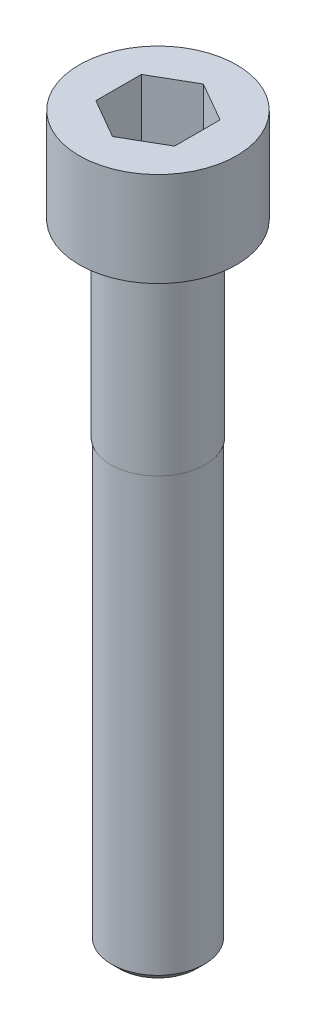
ISO-10303-21;
HEADER;
FILE_DESCRIPTION(('STEP AP214'),'2;1');
FILE_NAME('part.step','',(''),(''),'','','');
FILE_SCHEMA(('AUTOMOTIVE_DESIGN { 1 0 10303 214 1 1 1 1 }'));
ENDSEC;
DATA;
#1=APPLICATION_CONTEXT('core data for automotive mechanical design processes');
#2=APPLICATION_PROTOCOL_DEFINITION('international standard','automotive_design',2000,#1);
#3=PRODUCT_CONTEXT('',#1,'mechanical');
#4=PRODUCT('Part','Part','',(#3));
#5=PRODUCT_RELATED_PRODUCT_CATEGORY('part','',(#4));
#6=PRODUCT_DEFINITION_FORMATION('','',#4);
#7=PRODUCT_DEFINITION_CONTEXT('part definition',#1,'design');
#8=PRODUCT_DEFINITION('design','',#6,#7);
#9=PRODUCT_DEFINITION_SHAPE('','',#8);
#10=(LENGTH_UNIT() NAMED_UNIT(*) SI_UNIT(.MILLI.,.METRE.));
#11=(NAMED_UNIT(*) PLANE_ANGLE_UNIT() SI_UNIT($,.RADIAN.));
#12=(NAMED_UNIT(*) SI_UNIT($,.STERADIAN.) SOLID_ANGLE_UNIT());
#13=UNCERTAINTY_MEASURE_WITH_UNIT(LENGTH_MEASURE(1.E-05),#10,'distance_accuracy_value','');
#14=(GEOMETRIC_REPRESENTATION_CONTEXT(3) GLOBAL_UNCERTAINTY_ASSIGNED_CONTEXT((#13)) GLOBAL_UNIT_ASSIGNED_CONTEXT((#10,
#11,#12)) REPRESENTATION_CONTEXT('',''));
#15=CARTESIAN_POINT('',(0.,0.,0.));
#16=DIRECTION('',(0.,0.,1.));
#17=DIRECTION('',(1.,0.,0.));
#18=AXIS2_PLACEMENT_3D('',#15,#16,#17);
#19=CARTESIAN_POINT('',(0.,0.,0.));
#20=DIRECTION('',(0.,-1.,0.));
#21=DIRECTION('',(0.,0.,-1.));
#22=AXIS2_PLACEMENT_3D('',#19,#20,#21);
#23=PLANE('',#22);
#24=CARTESIAN_POINT('',(0.,0.,0.));
#25=DIRECTION('',(0.,1.,0.));
#26=DIRECTION('',(0.,0.,1.));
#27=AXIS2_PLACEMENT_3D('',#24,#25,#26);
#28=CIRCLE('',#27,2.44999999999999);
#29=CARTESIAN_POINT('',(0.,0.,2.44999999999999));
#30=VERTEX_POINT('',#29);
#31=EDGE_CURVE('E11',#30,#30,#28,.T.);
#32=ORIENTED_EDGE('',*,*,#31,.F.);
#33=EDGE_LOOP('',(#32));
#34=FACE_BOUND('',#33,.T.);
#35=ADVANCED_FACE('F33',(#34),#23,.T.);
#36=CARTESIAN_POINT('',(0.,0.5,0.));
#37=DIRECTION('',(0.,1.,0.));
#38=DIRECTION('',(0.,0.,1.));
#39=AXIS2_PLACEMENT_3D('',#36,#37,#38);
#40=CONICAL_SURFACE('',#39,2.94999999999999,0.785398163397448);
#41=ORIENTED_EDGE('',*,*,#31,.T.);
#42=EDGE_LOOP('',(#41));
#43=FACE_BOUND('',#42,.T.);
#44=CARTESIAN_POINT('',(0.,0.5,0.));
#45=DIRECTION('',(0.,1.,0.));
#46=DIRECTION('',(0.,0.,1.));
#47=AXIS2_PLACEMENT_3D('',#44,#45,#46);
#48=CIRCLE('',#47,2.94999999999999);
#49=CARTESIAN_POINT('',(0.,0.5,2.94999999999999));
#50=VERTEX_POINT('',#49);
#51=EDGE_CURVE('E40',#50,#50,#48,.T.);
#52=ORIENTED_EDGE('',*,*,#51,.F.);
#53=EDGE_LOOP('',(#52));
#54=FACE_BOUND('',#53,.T.);
#55=ADVANCED_FACE('F159',(#43,#54),#40,.T.);
#56=CARTESIAN_POINT('',(0.,46.,0.));
#57=DIRECTION('',(0.,1.,0.));
#58=DIRECTION('',(0.,0.,1.));
#59=AXIS2_PLACEMENT_3D('',#56,#57,#58);
#60=CYLINDRICAL_SURFACE('',#59,2.94999999999999);
#61=ORIENTED_EDGE('',*,*,#51,.T.);
#62=EDGE_LOOP('',(#61));
#63=FACE_BOUND('',#62,.T.);
#64=CARTESIAN_POINT('',(0.,28.,0.));
#65=DIRECTION('',(0.,1.,0.));
#66=DIRECTION('',(0.,0.,1.));
#67=AXIS2_PLACEMENT_3D('',#64,#65,#66);
#68=CIRCLE('',#67,2.94999999999999);
#69=CARTESIAN_POINT('',(0.,28.,2.94999999999999));
#70=VERTEX_POINT('',#69);
#71=EDGE_CURVE('E151',#70,#70,#68,.T.);
#72=ORIENTED_EDGE('',*,*,#71,.F.);
#73=EDGE_LOOP('',(#72));
#74=FACE_BOUND('',#73,.T.);
#75=ADVANCED_FACE('F156',(#63,#74),#60,.T.);
#76=CARTESIAN_POINT('',(-2.94999999999999,28.,0.));
#77=DIRECTION('',(0.,-1.,0.));
#78=DIRECTION('',(0.,0.,-1.));
#79=AXIS2_PLACEMENT_3D('',#76,#77,#78);
#80=PLANE('',#79);
#81=ORIENTED_EDGE('',*,*,#71,.T.);
#82=EDGE_LOOP('',(#81));
#83=FACE_BOUND('',#82,.T.);
#84=CARTESIAN_POINT('',(0.,28.,0.));
#85=DIRECTION('',(0.,1.,0.));
#86=DIRECTION('',(0.,0.,1.));
#87=AXIS2_PLACEMENT_3D('',#84,#85,#86);
#88=CIRCLE('',#87,3.);
#89=CARTESIAN_POINT('',(0.,28.,3.));
#90=VERTEX_POINT('',#89);
#91=EDGE_CURVE('E148',#90,#90,#88,.T.);
#92=ORIENTED_EDGE('',*,*,#91,.F.);
#93=EDGE_LOOP('',(#92));
#94=FACE_BOUND('',#93,.T.);
#95=ADVANCED_FACE('F166',(#83,#94),#80,.T.);
#96=CARTESIAN_POINT('',(0.,46.,0.));
#97=DIRECTION('',(0.,1.,0.));
#98=DIRECTION('',(0.,0.,1.));
#99=AXIS2_PLACEMENT_3D('',#96,#97,#98);
#100=CYLINDRICAL_SURFACE('',#99,3.);
#101=ORIENTED_EDGE('',*,*,#91,.T.);
#102=EDGE_LOOP('',(#101));
#103=FACE_BOUND('',#102,.T.);
#104=CARTESIAN_POINT('',(0.,40.,0.));
#105=DIRECTION('',(0.,1.,0.));
#106=DIRECTION('',(0.,0.,1.));
#107=AXIS2_PLACEMENT_3D('',#104,#105,#106);
#108=CIRCLE('',#107,3.);
#109=CARTESIAN_POINT('',(0.,40.,3.));
#110=VERTEX_POINT('',#109);
#111=EDGE_CURVE('E145',#110,#110,#108,.T.);
#112=ORIENTED_EDGE('',*,*,#111,.F.);
#113=EDGE_LOOP('',(#112));
#114=FACE_BOUND('',#113,.T.);
#115=ADVANCED_FACE('F172',(#103,#114),#100,.T.);
#116=CARTESIAN_POINT('',(-3.,40.,0.));
#117=DIRECTION('',(0.,-1.,0.));
#118=DIRECTION('',(0.,0.,-1.));
#119=AXIS2_PLACEMENT_3D('',#116,#117,#118);
#120=PLANE('',#119);
#121=ORIENTED_EDGE('',*,*,#111,.T.);
#122=EDGE_LOOP('',(#121));
#123=FACE_BOUND('',#122,.T.);
#124=CARTESIAN_POINT('',(0.,40.,0.));
#125=DIRECTION('',(0.,1.,0.));
#126=DIRECTION('',(0.,0.,1.));
#127=AXIS2_PLACEMENT_3D('',#124,#125,#126);
#128=CIRCLE('',#127,5.);
#129=CARTESIAN_POINT('',(0.,40.,5.));
#130=VERTEX_POINT('',#129);
#131=EDGE_CURVE('E142',#130,#130,#128,.T.);
#132=ORIENTED_EDGE('',*,*,#131,.F.);
#133=EDGE_LOOP('',(#132));
#134=FACE_BOUND('',#133,.T.);
#135=ADVANCED_FACE('F176',(#123,#134),#120,.T.);
#136=CARTESIAN_POINT('',(0.,46.,0.));
#137=DIRECTION('',(0.,1.,0.));
#138=DIRECTION('',(0.,0.,1.));
#139=AXIS2_PLACEMENT_3D('',#136,#137,#138);
#140=CYLINDRICAL_SURFACE('',#139,5.);
#141=ORIENTED_EDGE('',*,*,#131,.T.);
#142=EDGE_LOOP('',(#141));
#143=FACE_BOUND('',#142,.T.);
#144=CARTESIAN_POINT('',(0.,46.,0.));
#145=DIRECTION('',(0.,1.,0.));
#146=DIRECTION('',(0.,0.,1.));
#147=AXIS2_PLACEMENT_3D('',#144,#145,#146);
#148=CIRCLE('',#147,5.);
#149=CARTESIAN_POINT('',(0.,46.,5.));
#150=VERTEX_POINT('',#149);
#151=EDGE_CURVE('E134',#150,#150,#148,.T.);
#152=ORIENTED_EDGE('',*,*,#151,.F.);
#153=EDGE_LOOP('',(#152));
#154=FACE_BOUND('',#153,.T.);
#155=ADVANCED_FACE('F180',(#143,#154),#140,.T.);
#156=CARTESIAN_POINT('',(-5.,46.,0.));
#157=DIRECTION('',(0.,1.,0.));
#158=DIRECTION('',(0.,0.,1.));
#159=AXIS2_PLACEMENT_3D('',#156,#157,#158);
#160=PLANE('',#159);
#161=DIRECTION('',(0.866025403784439,0.,-0.5));
#162=VECTOR('',#161,1.);
#163=CARTESIAN_POINT('',(0.,46.,2.88675134594813));
#164=LINE('',#163,#162);
#165=CARTESIAN_POINT('',(0.,46.,2.88675134594813));
#166=VERTEX_POINT('',#165);
#167=CARTESIAN_POINT('',(2.5,46.,1.44337567297406));
#168=VERTEX_POINT('',#167);
#169=EDGE_CURVE('E47',#166,#168,#164,.T.);
#170=ORIENTED_EDGE('',*,*,#169,.F.);
#171=DIRECTION('',(0.866025403784439,0.,0.5));
#172=VECTOR('',#171,1.);
#173=CARTESIAN_POINT('',(-2.5,46.,1.44337567297406));
#174=LINE('',#173,#172);
#175=CARTESIAN_POINT('',(-2.5,46.,1.44337567297406));
#176=VERTEX_POINT('',#175);
#177=EDGE_CURVE('E130',#176,#166,#174,.T.);
#178=ORIENTED_EDGE('',*,*,#177,.F.);
#179=DIRECTION('',(0.,0.,1.));
#180=VECTOR('',#179,1.);
#181=CARTESIAN_POINT('',(-2.5,46.,-1.44337567297406));
#182=LINE('',#181,#180);
#183=CARTESIAN_POINT('',(-2.5,46.,-1.44337567297406));
#184=VERTEX_POINT('',#183);
#185=EDGE_CURVE('E128',#184,#176,#182,.T.);
#186=ORIENTED_EDGE('',*,*,#185,.F.);
#187=DIRECTION('',(-0.866025403784439,0.,0.5));
#188=VECTOR('',#187,1.);
#189=CARTESIAN_POINT('',(0.,46.,-2.88675134594813));
#190=LINE('',#189,#188);
#191=CARTESIAN_POINT('',(0.,46.,-2.88675134594813));
#192=VERTEX_POINT('',#191);
#193=EDGE_CURVE('E95',#192,#184,#190,.T.);
#194=ORIENTED_EDGE('',*,*,#193,.F.);
#195=DIRECTION('',(-0.866025403784439,0.,-0.5));
#196=VECTOR('',#195,1.);
#197=CARTESIAN_POINT('',(2.5,46.,-1.44337567297406));
#198=LINE('',#197,#196);
#199=CARTESIAN_POINT('',(2.5,46.,-1.44337567297406));
#200=VERTEX_POINT('',#199);
#201=EDGE_CURVE('E124',#200,#192,#198,.T.);
#202=ORIENTED_EDGE('',*,*,#201,.F.);
#203=DIRECTION('',(0.,0.,-1.));
#204=VECTOR('',#203,1.);
#205=CARTESIAN_POINT('',(2.5,46.,1.44337567297406));
#206=LINE('',#205,#204);
#207=EDGE_CURVE('E121',#168,#200,#206,.T.);
#208=ORIENTED_EDGE('',*,*,#207,.F.);
#209=EDGE_LOOP('',(#170,#178,#186,#194,#202,#208));
#210=FACE_BOUND('',#209,.T.);
#211=ORIENTED_EDGE('',*,*,#151,.T.);
#212=EDGE_LOOP('',(#211));
#213=FACE_BOUND('',#212,.T.);
#214=ADVANCED_FACE('F184',(#210,#213),#160,.T.);
#215=CARTESIAN_POINT('',(0.,42.,2.88675134594813));
#216=DIRECTION('',(0.5,0.,0.866025403784439));
#217=DIRECTION('',(0.866025403784439,0.,-0.5));
#218=AXIS2_PLACEMENT_3D('',#215,#216,#217);
#219=PLANE('',#218);
#220=ORIENTED_EDGE('',*,*,#169,.T.);
#221=DIRECTION('',(0.,1.,0.));
#222=VECTOR('',#221,1.);
#223=CARTESIAN_POINT('',(2.5,42.,1.44337567297406));
#224=LINE('',#223,#222);
#225=CARTESIAN_POINT('',(2.5,42.,1.44337567297406));
#226=VERTEX_POINT('',#225);
#227=EDGE_CURVE('E77',#226,#168,#224,.T.);
#228=ORIENTED_EDGE('',*,*,#227,.F.);
#229=DIRECTION('',(0.866025403784439,0.,-0.5));
#230=VECTOR('',#229,1.);
#231=CARTESIAN_POINT('',(0.,42.,2.88675134594813));
#232=LINE('',#231,#230);
#233=CARTESIAN_POINT('',(0.,42.,2.88675134594813));
#234=VERTEX_POINT('',#233);
#235=EDGE_CURVE('E132',#234,#226,#232,.T.);
#236=ORIENTED_EDGE('',*,*,#235,.F.);
#237=DIRECTION('',(0.,1.,0.));
#238=VECTOR('',#237,1.);
#239=CARTESIAN_POINT('',(0.,42.,2.88675134594813));
#240=LINE('',#239,#238);
#241=EDGE_CURVE('E55',#234,#166,#240,.T.);
#242=ORIENTED_EDGE('',*,*,#241,.T.);
#243=EDGE_LOOP('',(#220,#228,#236,#242));
#244=FACE_BOUND('',#243,.T.);
#245=ADVANCED_FACE('F188',(#244),#219,.F.);
#246=CARTESIAN_POINT('',(-2.5,42.,1.44337567297406));
#247=DIRECTION('',(-0.5,0.,0.866025403784439));
#248=DIRECTION('',(0.866025403784439,0.,0.5));
#249=AXIS2_PLACEMENT_3D('',#246,#247,#248);
#250=PLANE('',#249);
#251=ORIENTED_EDGE('',*,*,#177,.T.);
#252=ORIENTED_EDGE('',*,*,#241,.F.);
#253=DIRECTION('',(0.866025403784439,0.,0.5));
#254=VECTOR('',#253,1.);
#255=CARTESIAN_POINT('',(-2.5,42.,1.44337567297406));
#256=LINE('',#255,#254);
#257=CARTESIAN_POINT('',(-2.5,42.,1.44337567297406));
#258=VERTEX_POINT('',#257);
#259=EDGE_CURVE('E107',#258,#234,#256,.T.);
#260=ORIENTED_EDGE('',*,*,#259,.F.);
#261=DIRECTION('',(0.,1.,0.));
#262=VECTOR('',#261,1.);
#263=CARTESIAN_POINT('',(-2.5,42.,1.44337567297406));
#264=LINE('',#263,#262);
#265=EDGE_CURVE('E99',#258,#176,#264,.T.);
#266=ORIENTED_EDGE('',*,*,#265,.T.);
#267=EDGE_LOOP('',(#251,#252,#260,#266));
#268=FACE_BOUND('',#267,.T.);
#269=ADVANCED_FACE('F192',(#268),#250,.F.);
#270=CARTESIAN_POINT('',(-2.5,42.,-1.44337567297406));
#271=DIRECTION('',(-1.,0.,0.));
#272=DIRECTION('',(0.,0.,1.));
#273=AXIS2_PLACEMENT_3D('',#270,#271,#272);
#274=PLANE('',#273);
#275=ORIENTED_EDGE('',*,*,#185,.T.);
#276=ORIENTED_EDGE('',*,*,#265,.F.);
#277=DIRECTION('',(0.,0.,1.));
#278=VECTOR('',#277,1.);
#279=CARTESIAN_POINT('',(-2.5,42.,-1.44337567297406));
#280=LINE('',#279,#278);
#281=CARTESIAN_POINT('',(-2.5,42.,-1.44337567297406));
#282=VERTEX_POINT('',#281);
#283=EDGE_CURVE('E103',#282,#258,#280,.T.);
#284=ORIENTED_EDGE('',*,*,#283,.F.);
#285=DIRECTION('',(0.,1.,0.));
#286=VECTOR('',#285,1.);
#287=CARTESIAN_POINT('',(-2.5,42.,-1.44337567297406));
#288=LINE('',#287,#286);
#289=EDGE_CURVE('E88',#282,#184,#288,.T.);
#290=ORIENTED_EDGE('',*,*,#289,.T.);
#291=EDGE_LOOP('',(#275,#276,#284,#290));
#292=FACE_BOUND('',#291,.T.);
#293=ADVANCED_FACE('F104',(#292),#274,.F.);
#294=CARTESIAN_POINT('',(0.,42.,-2.88675134594813));
#295=DIRECTION('',(-0.5,0.,-0.866025403784439));
#296=DIRECTION('',(-0.866025403784439,0.,0.5));
#297=AXIS2_PLACEMENT_3D('',#294,#295,#296);
#298=PLANE('',#297);
#299=ORIENTED_EDGE('',*,*,#193,.T.);
#300=ORIENTED_EDGE('',*,*,#289,.F.);
#301=DIRECTION('',(-0.866025403784439,0.,0.5));
#302=VECTOR('',#301,1.);
#303=CARTESIAN_POINT('',(0.,42.,-2.88675134594813));
#304=LINE('',#303,#302);
#305=CARTESIAN_POINT('',(0.,42.,-2.88675134594813));
#306=VERTEX_POINT('',#305);
#307=EDGE_CURVE('E92',#306,#282,#304,.T.);
#308=ORIENTED_EDGE('',*,*,#307,.F.);
#309=DIRECTION('',(0.,1.,0.));
#310=VECTOR('',#309,1.);
#311=CARTESIAN_POINT('',(0.,42.,-2.88675134594813));
#312=LINE('',#311,#310);
#313=EDGE_CURVE('E100',#306,#192,#312,.T.);
#314=ORIENTED_EDGE('',*,*,#313,.T.);
#315=EDGE_LOOP('',(#299,#300,#308,#314));
#316=FACE_BOUND('',#315,.T.);
#317=ADVANCED_FACE('F90',(#316),#298,.F.);
#318=CARTESIAN_POINT('',(2.5,42.,-1.44337567297406));
#319=DIRECTION('',(0.5,0.,-0.866025403784439));
#320=DIRECTION('',(-0.866025403784439,0.,-0.5));
#321=AXIS2_PLACEMENT_3D('',#318,#319,#320);
#322=PLANE('',#321);
#323=ORIENTED_EDGE('',*,*,#201,.T.);
#324=ORIENTED_EDGE('',*,*,#313,.F.);
#325=DIRECTION('',(-0.866025403784439,0.,-0.5));
#326=VECTOR('',#325,1.);
#327=CARTESIAN_POINT('',(2.5,42.,-1.44337567297406));
#328=LINE('',#327,#326);
#329=CARTESIAN_POINT('',(2.5,42.,-1.44337567297406));
#330=VERTEX_POINT('',#329);
#331=EDGE_CURVE('E113',#330,#306,#328,.T.);
#332=ORIENTED_EDGE('',*,*,#331,.F.);
#333=DIRECTION('',(0.,1.,0.));
#334=VECTOR('',#333,1.);
#335=CARTESIAN_POINT('',(2.5,42.,-1.44337567297406));
#336=LINE('',#335,#334);
#337=EDGE_CURVE('E137',#330,#200,#336,.T.);
#338=ORIENTED_EDGE('',*,*,#337,.T.);
#339=EDGE_LOOP('',(#323,#324,#332,#338));
#340=FACE_BOUND('',#339,.T.);
#341=ADVANCED_FACE('F196',(#340),#322,.F.);
#342=CARTESIAN_POINT('',(2.5,42.,1.44337567297406));
#343=DIRECTION('',(1.,0.,0.));
#344=DIRECTION('',(0.,0.,-1.));
#345=AXIS2_PLACEMENT_3D('',#342,#343,#344);
#346=PLANE('',#345);
#347=ORIENTED_EDGE('',*,*,#207,.T.);
#348=ORIENTED_EDGE('',*,*,#337,.F.);
#349=DIRECTION('',(0.,0.,-1.));
#350=VECTOR('',#349,1.);
#351=CARTESIAN_POINT('',(2.5,42.,1.44337567297406));
#352=LINE('',#351,#350);
#353=EDGE_CURVE('E115',#226,#330,#352,.T.);
#354=ORIENTED_EDGE('',*,*,#353,.F.);
#355=ORIENTED_EDGE('',*,*,#227,.T.);
#356=EDGE_LOOP('',(#347,#348,#354,#355));
#357=FACE_BOUND('',#356,.T.);
#358=ADVANCED_FACE('F193',(#357),#346,.F.);
#359=CARTESIAN_POINT('',(0.,42.,0.));
#360=DIRECTION('',(0.,1.,0.));
#361=DIRECTION('',(0.,0.,1.));
#362=AXIS2_PLACEMENT_3D('',#359,#360,#361);
#363=PLANE('',#362);
#364=ORIENTED_EDGE('',*,*,#235,.T.);
#365=ORIENTED_EDGE('',*,*,#353,.T.);
#366=ORIENTED_EDGE('',*,*,#331,.T.);
#367=ORIENTED_EDGE('',*,*,#307,.T.);
#368=ORIENTED_EDGE('',*,*,#283,.T.);
#369=ORIENTED_EDGE('',*,*,#259,.T.);
#370=EDGE_LOOP('',(#364,#365,#366,#367,#368,#369));
#371=FACE_BOUND('',#370,.T.);
#372=ADVANCED_FACE('F110',(#371),#363,.T.);
#373=CLOSED_SHELL('',(#35,#55,#75,#95,#115,#135,#155,#214,#245,#269,#293,#317,#341,#358,#372));
#374=MANIFOLD_SOLID_BREP('B2',#373);
#375=ADVANCED_BREP_SHAPE_REPRESENTATION('',(#18,#374),#14);
#376=SHAPE_DEFINITION_REPRESENTATION(#9,#375);
ENDSEC;
END-ISO-10303-21;
